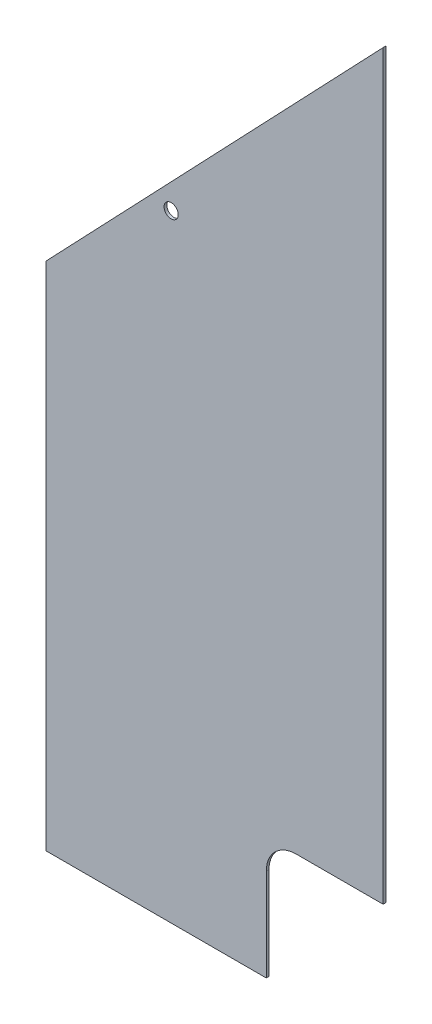
ISO-10303-21;
HEADER;
FILE_DESCRIPTION(('STEP AP214'),'2;1');
FILE_NAME('part.step','',(''),(''),'','','');
FILE_SCHEMA(('AUTOMOTIVE_DESIGN { 1 0 10303 214 1 1 1 1 }'));
ENDSEC;
DATA;
#1=APPLICATION_CONTEXT('core data for automotive mechanical design processes');
#2=APPLICATION_PROTOCOL_DEFINITION('international standard','automotive_design',2000,#1);
#3=PRODUCT_CONTEXT('',#1,'mechanical');
#4=PRODUCT('Part','Part','',(#3));
#5=PRODUCT_RELATED_PRODUCT_CATEGORY('part','',(#4));
#6=PRODUCT_DEFINITION_FORMATION('','',#4);
#7=PRODUCT_DEFINITION_CONTEXT('part definition',#1,'design');
#8=PRODUCT_DEFINITION('design','',#6,#7);
#9=PRODUCT_DEFINITION_SHAPE('','',#8);
#10=(LENGTH_UNIT() NAMED_UNIT(*) SI_UNIT(.MILLI.,.METRE.));
#11=(NAMED_UNIT(*) PLANE_ANGLE_UNIT() SI_UNIT($,.RADIAN.));
#12=(NAMED_UNIT(*) SI_UNIT($,.STERADIAN.) SOLID_ANGLE_UNIT());
#13=UNCERTAINTY_MEASURE_WITH_UNIT(LENGTH_MEASURE(1.E-05),#10,'distance_accuracy_value','');
#14=(GEOMETRIC_REPRESENTATION_CONTEXT(3) GLOBAL_UNCERTAINTY_ASSIGNED_CONTEXT((#13)) GLOBAL_UNIT_ASSIGNED_CONTEXT((#10,
#11,#12)) REPRESENTATION_CONTEXT('',''));
#15=CARTESIAN_POINT('',(0.,0.,0.));
#16=DIRECTION('',(0.,0.,1.));
#17=DIRECTION('',(1.,0.,0.));
#18=AXIS2_PLACEMENT_3D('',#15,#16,#17);
#19=CARTESIAN_POINT('',(-393.7,0.,3.175));
#20=DIRECTION('',(1.,0.,0.));
#21=DIRECTION('',(0.,0.,-1.));
#22=AXIS2_PLACEMENT_3D('',#19,#20,#21);
#23=PLANE('',#22);
#24=DIRECTION('',(0.,-1.,0.));
#25=VECTOR('',#24,1.);
#26=CARTESIAN_POINT('',(-393.7,0.,0.));
#27=LINE('',#26,#25);
#28=CARTESIAN_POINT('',(-393.7,596.9,0.));
#29=VERTEX_POINT('',#28);
#30=CARTESIAN_POINT('',(-393.7,0.,0.));
#31=VERTEX_POINT('',#30);
#32=EDGE_CURVE('E125',#29,#31,#27,.T.);
#33=ORIENTED_EDGE('',*,*,#32,.T.);
#34=DIRECTION('',(0.,0.,-1.));
#35=VECTOR('',#34,1.);
#36=CARTESIAN_POINT('',(-393.7,0.,3.175));
#37=LINE('',#36,#35);
#38=CARTESIAN_POINT('',(-393.7,0.,3.175));
#39=VERTEX_POINT('',#38);
#40=EDGE_CURVE('E11',#39,#31,#37,.T.);
#41=ORIENTED_EDGE('',*,*,#40,.F.);
#42=DIRECTION('',(0.,-1.,0.));
#43=VECTOR('',#42,1.);
#44=CARTESIAN_POINT('',(-393.7,0.,3.175));
#45=LINE('',#44,#43);
#46=CARTESIAN_POINT('',(-393.7,596.9,3.175));
#47=VERTEX_POINT('',#46);
#48=EDGE_CURVE('E122',#47,#39,#45,.T.);
#49=ORIENTED_EDGE('',*,*,#48,.F.);
#50=DIRECTION('',(0.,0.,-1.));
#51=VECTOR('',#50,1.);
#52=CARTESIAN_POINT('',(-393.7,596.9,3.175));
#53=LINE('',#52,#51);
#54=EDGE_CURVE('E129',#47,#29,#53,.T.);
#55=ORIENTED_EDGE('',*,*,#54,.T.);
#56=EDGE_LOOP('',(#33,#41,#49,#55));
#57=FACE_BOUND('',#56,.T.);
#58=ADVANCED_FACE('F32',(#57),#23,.F.);
#59=CARTESIAN_POINT('',(0.,0.,3.175));
#60=DIRECTION('',(0.,1.,0.));
#61=DIRECTION('',(-1.,0.,0.));
#62=AXIS2_PLACEMENT_3D('',#59,#60,#61);
#63=PLANE('',#62);
#64=DIRECTION('',(1.,0.,0.));
#65=VECTOR('',#64,1.);
#66=CARTESIAN_POINT('',(0.,0.,0.));
#67=LINE('',#66,#65);
#68=CARTESIAN_POINT('',(-136.525,0.,0.));
#69=VERTEX_POINT('',#68);
#70=EDGE_CURVE('E120',#31,#69,#67,.T.);
#71=ORIENTED_EDGE('',*,*,#70,.T.);
#72=DIRECTION('',(0.,0.,1.));
#73=VECTOR('',#72,1.);
#74=CARTESIAN_POINT('',(-136.525,0.,0.));
#75=LINE('',#74,#73);
#76=CARTESIAN_POINT('',(-136.525,0.,3.175));
#77=VERTEX_POINT('',#76);
#78=EDGE_CURVE('E145',#69,#77,#75,.T.);
#79=ORIENTED_EDGE('',*,*,#78,.T.);
#80=DIRECTION('',(1.,0.,0.));
#81=VECTOR('',#80,1.);
#82=CARTESIAN_POINT('',(0.,0.,3.175));
#83=LINE('',#82,#81);
#84=EDGE_CURVE('E78',#39,#77,#83,.T.);
#85=ORIENTED_EDGE('',*,*,#84,.F.);
#86=ORIENTED_EDGE('',*,*,#40,.T.);
#87=EDGE_LOOP('',(#71,#79,#85,#86));
#88=FACE_BOUND('',#87,.T.);
#89=ADVANCED_FACE('F153',(#88),#63,.F.);
#90=CARTESIAN_POINT('',(-1.23165366794353E-13,1009.65,3.175));
#91=DIRECTION('',(-1.,0.,0.));
#92=DIRECTION('',(0.,-1.,0.));
#93=AXIS2_PLACEMENT_3D('',#90,#91,#92);
#94=PLANE('',#93);
#95=DIRECTION('',(0.,1.,0.));
#96=VECTOR('',#95,1.);
#97=CARTESIAN_POINT('',(-1.23165366794353E-13,1009.65,3.175));
#98=LINE('',#97,#96);
#99=CARTESIAN_POINT('',(0.,142.875,3.175));
#100=VERTEX_POINT('',#99);
#101=CARTESIAN_POINT('',(-1.23165366794353E-13,1009.65,3.175));
#102=VERTEX_POINT('',#101);
#103=EDGE_CURVE('E115',#100,#102,#98,.T.);
#104=ORIENTED_EDGE('',*,*,#103,.F.);
#105=DIRECTION('',(0.,0.,1.));
#106=VECTOR('',#105,1.);
#107=CARTESIAN_POINT('',(0.,142.875,0.));
#108=LINE('',#107,#106);
#109=CARTESIAN_POINT('',(0.,142.875,0.));
#110=VERTEX_POINT('',#109);
#111=EDGE_CURVE('E103',#110,#100,#108,.T.);
#112=ORIENTED_EDGE('',*,*,#111,.F.);
#113=DIRECTION('',(0.,1.,0.));
#114=VECTOR('',#113,1.);
#115=CARTESIAN_POINT('',(-1.23165366794353E-13,1009.65,0.));
#116=LINE('',#115,#114);
#117=CARTESIAN_POINT('',(-1.23165366794353E-13,1009.65,0.));
#118=VERTEX_POINT('',#117);
#119=EDGE_CURVE('E114',#110,#118,#116,.T.);
#120=ORIENTED_EDGE('',*,*,#119,.T.);
#121=DIRECTION('',(0.,0.,-1.));
#122=VECTOR('',#121,1.);
#123=CARTESIAN_POINT('',(-1.23165366794353E-13,1009.65,3.175));
#124=LINE('',#123,#122);
#125=EDGE_CURVE('E39',#102,#118,#124,.T.);
#126=ORIENTED_EDGE('',*,*,#125,.F.);
#127=EDGE_LOOP('',(#104,#112,#120,#126));
#128=FACE_BOUND('',#127,.T.);
#129=ADVANCED_FACE('F112',(#128),#94,.F.);
#130=CARTESIAN_POINT('',(-393.7,596.9,3.175));
#131=DIRECTION('',(0.723608232033296,-0.690210929016375,0.));
#132=DIRECTION('',(0.690210929016375,0.723608232033296,0.));
#133=AXIS2_PLACEMENT_3D('',#130,#131,#132);
#134=PLANE('',#133);
#135=DIRECTION('',(-0.690210929016375,-0.723608232033296,0.));
#136=VECTOR('',#135,1.);
#137=CARTESIAN_POINT('',(-393.7,596.9,0.));
#138=LINE('',#137,#136);
#139=EDGE_CURVE('E72',#118,#29,#138,.T.);
#140=ORIENTED_EDGE('',*,*,#139,.T.);
#141=ORIENTED_EDGE('',*,*,#54,.F.);
#142=DIRECTION('',(-0.690210929016375,-0.723608232033296,0.));
#143=VECTOR('',#142,1.);
#144=CARTESIAN_POINT('',(-393.7,596.9,3.175));
#145=LINE('',#144,#143);
#146=EDGE_CURVE('E55',#102,#47,#145,.T.);
#147=ORIENTED_EDGE('',*,*,#146,.F.);
#148=ORIENTED_EDGE('',*,*,#125,.T.);
#149=EDGE_LOOP('',(#140,#141,#147,#148));
#150=FACE_BOUND('',#149,.T.);
#151=ADVANCED_FACE('F130',(#150),#134,.F.);
#152=CARTESIAN_POINT('',(0.,0.,3.175));
#153=DIRECTION('',(0.,0.,1.));
#154=DIRECTION('',(1.,0.,0.));
#155=AXIS2_PLACEMENT_3D('',#152,#153,#154);
#156=PLANE('',#155);
#157=DIRECTION('',(0.,-1.,0.));
#158=VECTOR('',#157,1.);
#159=CARTESIAN_POINT('',(-136.525,107.95,3.175));
#160=LINE('',#159,#158);
#161=CARTESIAN_POINT('',(-136.525,107.95,3.175));
#162=VERTEX_POINT('',#161);
#163=EDGE_CURVE('E108',#162,#77,#160,.T.);
#164=ORIENTED_EDGE('',*,*,#163,.F.);
#165=CARTESIAN_POINT('',(-101.6,107.95,3.175));
#166=DIRECTION('',(0.,0.,1.));
#167=DIRECTION('',(1.,0.,0.));
#168=AXIS2_PLACEMENT_3D('',#165,#166,#167);
#169=CIRCLE('',#168,34.925);
#170=CARTESIAN_POINT('',(-101.6,142.875,3.175));
#171=VERTEX_POINT('',#170);
#172=EDGE_CURVE('E162',#171,#162,#169,.T.);
#173=ORIENTED_EDGE('',*,*,#172,.F.);
#174=DIRECTION('',(-1.,0.,0.));
#175=VECTOR('',#174,1.);
#176=CARTESIAN_POINT('',(0.,142.875,3.175));
#177=LINE('',#176,#175);
#178=EDGE_CURVE('E160',#100,#171,#177,.T.);
#179=ORIENTED_EDGE('',*,*,#178,.F.);
#180=ORIENTED_EDGE('',*,*,#103,.T.);
#181=ORIENTED_EDGE('',*,*,#146,.T.);
#182=ORIENTED_EDGE('',*,*,#48,.T.);
#183=ORIENTED_EDGE('',*,*,#84,.T.);
#184=EDGE_LOOP('',(#164,#173,#179,#180,#181,#182,#183));
#185=FACE_BOUND('',#184,.T.);
#186=CARTESIAN_POINT('',(-247.650000000001,720.725,3.175));
#187=DIRECTION('',(0.,0.,1.));
#188=DIRECTION('',(1.,0.,0.));
#189=AXIS2_PLACEMENT_3D('',#186,#187,#188);
#190=CIRCLE('',#189,8.25500000000002);
#191=CARTESIAN_POINT('',(-239.395000000001,720.725,3.175));
#192=VERTEX_POINT('',#191);
#193=EDGE_CURVE('E140',#192,#192,#190,.T.);
#194=ORIENTED_EDGE('',*,*,#193,.F.);
#195=EDGE_LOOP('',(#194));
#196=FACE_BOUND('',#195,.T.);
#197=ADVANCED_FACE('F150',(#185,#196),#156,.T.);
#198=CARTESIAN_POINT('',(0.,0.,0.));
#199=DIRECTION('',(0.,0.,1.));
#200=DIRECTION('',(1.,0.,0.));
#201=AXIS2_PLACEMENT_3D('',#198,#199,#200);
#202=PLANE('',#201);
#203=CARTESIAN_POINT('',(-247.650000000001,720.725,0.));
#204=DIRECTION('',(0.,0.,1.));
#205=DIRECTION('',(1.,0.,0.));
#206=AXIS2_PLACEMENT_3D('',#203,#204,#205);
#207=CIRCLE('',#206,8.25500000000002);
#208=CARTESIAN_POINT('',(-239.395000000001,720.725,0.));
#209=VERTEX_POINT('',#208);
#210=EDGE_CURVE('E136',#209,#209,#207,.T.);
#211=ORIENTED_EDGE('',*,*,#210,.T.);
#212=EDGE_LOOP('',(#211));
#213=FACE_BOUND('',#212,.T.);
#214=CARTESIAN_POINT('',(-101.6,107.95,0.));
#215=DIRECTION('',(0.,0.,1.));
#216=DIRECTION('',(1.,0.,0.));
#217=AXIS2_PLACEMENT_3D('',#214,#215,#216);
#218=CIRCLE('',#217,34.925);
#219=CARTESIAN_POINT('',(-101.6,142.875,0.));
#220=VERTEX_POINT('',#219);
#221=CARTESIAN_POINT('',(-136.525,107.95,0.));
#222=VERTEX_POINT('',#221);
#223=EDGE_CURVE('E46',#220,#222,#218,.T.);
#224=ORIENTED_EDGE('',*,*,#223,.T.);
#225=DIRECTION('',(0.,-1.,0.));
#226=VECTOR('',#225,1.);
#227=CARTESIAN_POINT('',(-136.525,107.95,0.));
#228=LINE('',#227,#226);
#229=EDGE_CURVE('E116',#222,#69,#228,.T.);
#230=ORIENTED_EDGE('',*,*,#229,.T.);
#231=ORIENTED_EDGE('',*,*,#70,.F.);
#232=ORIENTED_EDGE('',*,*,#32,.F.);
#233=ORIENTED_EDGE('',*,*,#139,.F.);
#234=ORIENTED_EDGE('',*,*,#119,.F.);
#235=DIRECTION('',(-1.,0.,0.));
#236=VECTOR('',#235,1.);
#237=CARTESIAN_POINT('',(0.,142.875,0.));
#238=LINE('',#237,#236);
#239=EDGE_CURVE('E99',#110,#220,#238,.T.);
#240=ORIENTED_EDGE('',*,*,#239,.T.);
#241=EDGE_LOOP('',(#224,#230,#231,#232,#233,#234,#240));
#242=FACE_BOUND('',#241,.T.);
#243=ADVANCED_FACE('F118',(#213,#242),#202,.F.);
#244=CARTESIAN_POINT('',(-247.650000000001,720.725,0.));
#245=DIRECTION('',(0.,0.,1.));
#246=DIRECTION('',(1.,0.,0.));
#247=AXIS2_PLACEMENT_3D('',#244,#245,#246);
#248=CYLINDRICAL_SURFACE('',#247,8.25500000000002);
#249=ORIENTED_EDGE('',*,*,#210,.F.);
#250=EDGE_LOOP('',(#249));
#251=FACE_BOUND('',#250,.T.);
#252=ORIENTED_EDGE('',*,*,#193,.T.);
#253=EDGE_LOOP('',(#252));
#254=FACE_BOUND('',#253,.T.);
#255=ADVANCED_FACE('F171',(#251,#254),#248,.F.);
#256=CARTESIAN_POINT('',(-136.525,107.95,0.));
#257=DIRECTION('',(-1.,0.,0.));
#258=DIRECTION('',(0.,-1.,0.));
#259=AXIS2_PLACEMENT_3D('',#256,#257,#258);
#260=PLANE('',#259);
#261=ORIENTED_EDGE('',*,*,#163,.T.);
#262=ORIENTED_EDGE('',*,*,#78,.F.);
#263=ORIENTED_EDGE('',*,*,#229,.F.);
#264=DIRECTION('',(0.,0.,1.));
#265=VECTOR('',#264,1.);
#266=CARTESIAN_POINT('',(-136.525,107.95,0.));
#267=LINE('',#266,#265);
#268=EDGE_CURVE('E167',#222,#162,#267,.T.);
#269=ORIENTED_EDGE('',*,*,#268,.T.);
#270=EDGE_LOOP('',(#261,#262,#263,#269));
#271=FACE_BOUND('',#270,.T.);
#272=ADVANCED_FACE('F169',(#271),#260,.F.);
#273=CARTESIAN_POINT('',(-101.6,107.95,0.));
#274=DIRECTION('',(0.,0.,1.));
#275=DIRECTION('',(1.,0.,0.));
#276=AXIS2_PLACEMENT_3D('',#273,#274,#275);
#277=CYLINDRICAL_SURFACE('',#276,34.925);
#278=ORIENTED_EDGE('',*,*,#172,.T.);
#279=ORIENTED_EDGE('',*,*,#268,.F.);
#280=ORIENTED_EDGE('',*,*,#223,.F.);
#281=DIRECTION('',(0.,0.,1.));
#282=VECTOR('',#281,1.);
#283=CARTESIAN_POINT('',(-101.6,142.875,0.));
#284=LINE('',#283,#282);
#285=EDGE_CURVE('E105',#220,#171,#284,.T.);
#286=ORIENTED_EDGE('',*,*,#285,.T.);
#287=EDGE_LOOP('',(#278,#279,#280,#286));
#288=FACE_BOUND('',#287,.T.);
#289=ADVANCED_FACE('F168',(#288),#277,.F.);
#290=CARTESIAN_POINT('',(0.,142.875,0.));
#291=DIRECTION('',(0.,1.,0.));
#292=DIRECTION('',(-1.,0.,0.));
#293=AXIS2_PLACEMENT_3D('',#290,#291,#292);
#294=PLANE('',#293);
#295=ORIENTED_EDGE('',*,*,#178,.T.);
#296=ORIENTED_EDGE('',*,*,#285,.F.);
#297=ORIENTED_EDGE('',*,*,#239,.F.);
#298=ORIENTED_EDGE('',*,*,#111,.T.);
#299=EDGE_LOOP('',(#295,#296,#297,#298));
#300=FACE_BOUND('',#299,.T.);
#301=ADVANCED_FACE('F102',(#300),#294,.F.);
#302=CLOSED_SHELL('',(#58,#89,#129,#151,#197,#243,#255,#272,#289,#301));
#303=MANIFOLD_SOLID_BREP('B2',#302);
#304=ADVANCED_BREP_SHAPE_REPRESENTATION('',(#18,#303),#14);
#305=SHAPE_DEFINITION_REPRESENTATION(#9,#304);
ENDSEC;
END-ISO-10303-21;
